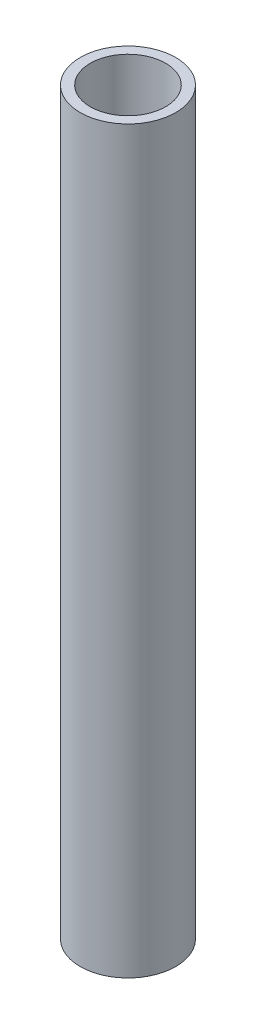
ISO-10303-21;
HEADER;
FILE_DESCRIPTION(('STEP AP214'),'2;1');
FILE_NAME('part.step','',(''),(''),'','','');
FILE_SCHEMA(('AUTOMOTIVE_DESIGN { 1 0 10303 214 1 1 1 1 }'));
ENDSEC;
DATA;
#1=APPLICATION_CONTEXT('core data for automotive mechanical design processes');
#2=APPLICATION_PROTOCOL_DEFINITION('international standard','automotive_design',2000,#1);
#3=PRODUCT_CONTEXT('',#1,'mechanical');
#4=PRODUCT('Part','Part','',(#3));
#5=PRODUCT_RELATED_PRODUCT_CATEGORY('part','',(#4));
#6=PRODUCT_DEFINITION_FORMATION('','',#4);
#7=PRODUCT_DEFINITION_CONTEXT('part definition',#1,'design');
#8=PRODUCT_DEFINITION('design','',#6,#7);
#9=PRODUCT_DEFINITION_SHAPE('','',#8);
#10=(LENGTH_UNIT() NAMED_UNIT(*) SI_UNIT(.MILLI.,.METRE.));
#11=(NAMED_UNIT(*) PLANE_ANGLE_UNIT() SI_UNIT($,.RADIAN.));
#12=(NAMED_UNIT(*) SI_UNIT($,.STERADIAN.) SOLID_ANGLE_UNIT());
#13=UNCERTAINTY_MEASURE_WITH_UNIT(LENGTH_MEASURE(1.E-05),#10,'distance_accuracy_value','');
#14=(GEOMETRIC_REPRESENTATION_CONTEXT(3) GLOBAL_UNCERTAINTY_ASSIGNED_CONTEXT((#13)) GLOBAL_UNIT_ASSIGNED_CONTEXT((#10,
#11,#12)) REPRESENTATION_CONTEXT('',''));
#15=CARTESIAN_POINT('',(0.,0.,0.));
#16=DIRECTION('',(0.,0.,1.));
#17=DIRECTION('',(1.,0.,0.));
#18=AXIS2_PLACEMENT_3D('',#15,#16,#17);
#19=CARTESIAN_POINT('',(0.,186.817,0.));
#20=DIRECTION('',(0.,1.,0.));
#21=DIRECTION('',(0.,0.,1.));
#22=AXIS2_PLACEMENT_3D('',#19,#20,#21);
#23=PLANE('',#22);
#24=CARTESIAN_POINT('',(0.,186.817,0.));
#25=DIRECTION('',(0.,1.,0.));
#26=DIRECTION('',(0.,0.,1.));
#27=AXIS2_PLACEMENT_3D('',#24,#25,#26);
#28=CIRCLE('',#27,24.13);
#29=CARTESIAN_POINT('',(0.,186.817,24.13));
#30=VERTEX_POINT('',#29);
#31=EDGE_CURVE('E10',#30,#30,#28,.T.);
#32=ORIENTED_EDGE('',*,*,#31,.T.);
#33=EDGE_LOOP('',(#32));
#34=FACE_BOUND('',#33,.T.);
#35=CARTESIAN_POINT('',(0.,186.817,0.));
#36=DIRECTION('',(0.,1.,0.));
#37=DIRECTION('',(0.,0.,1.));
#38=AXIS2_PLACEMENT_3D('',#35,#36,#37);
#39=CIRCLE('',#38,19.05);
#40=CARTESIAN_POINT('',(0.,186.817,19.05));
#41=VERTEX_POINT('',#40);
#42=EDGE_CURVE('E46',#41,#41,#39,.T.);
#43=ORIENTED_EDGE('',*,*,#42,.F.);
#44=EDGE_LOOP('',(#43));
#45=FACE_BOUND('',#44,.T.);
#46=ADVANCED_FACE('F35',(#34,#45),#23,.T.);
#47=CARTESIAN_POINT('',(0.,-186.817,0.));
#48=DIRECTION('',(0.,1.,0.));
#49=DIRECTION('',(0.,0.,1.));
#50=AXIS2_PLACEMENT_3D('',#47,#48,#49);
#51=PLANE('',#50);
#52=CARTESIAN_POINT('',(0.,-186.817,0.));
#53=DIRECTION('',(0.,1.,0.));
#54=DIRECTION('',(0.,0.,1.));
#55=AXIS2_PLACEMENT_3D('',#52,#53,#54);
#56=CIRCLE('',#55,24.13);
#57=CARTESIAN_POINT('',(0.,-186.817,24.13));
#58=VERTEX_POINT('',#57);
#59=EDGE_CURVE('E39',#58,#58,#56,.T.);
#60=ORIENTED_EDGE('',*,*,#59,.F.);
#61=EDGE_LOOP('',(#60));
#62=FACE_BOUND('',#61,.T.);
#63=CARTESIAN_POINT('',(0.,-186.817,0.));
#64=DIRECTION('',(0.,1.,0.));
#65=DIRECTION('',(0.,0.,1.));
#66=AXIS2_PLACEMENT_3D('',#63,#64,#65);
#67=CIRCLE('',#66,19.05);
#68=CARTESIAN_POINT('',(0.,-186.817,19.05));
#69=VERTEX_POINT('',#68);
#70=EDGE_CURVE('E48',#69,#69,#67,.T.);
#71=ORIENTED_EDGE('',*,*,#70,.T.);
#72=EDGE_LOOP('',(#71));
#73=FACE_BOUND('',#72,.T.);
#74=ADVANCED_FACE('F58',(#62,#73),#51,.F.);
#75=CARTESIAN_POINT('',(0.,186.817,0.));
#76=DIRECTION('',(0.,-1.,0.));
#77=DIRECTION('',(0.,0.,-1.));
#78=AXIS2_PLACEMENT_3D('',#75,#76,#77);
#79=CYLINDRICAL_SURFACE('',#78,24.13);
#80=ORIENTED_EDGE('',*,*,#31,.F.);
#81=EDGE_LOOP('',(#80));
#82=FACE_BOUND('',#81,.T.);
#83=ORIENTED_EDGE('',*,*,#59,.T.);
#84=EDGE_LOOP('',(#83));
#85=FACE_BOUND('',#84,.T.);
#86=ADVANCED_FACE('F37',(#82,#85),#79,.T.);
#87=CARTESIAN_POINT('',(0.,186.817,0.));
#88=DIRECTION('',(0.,-1.,0.));
#89=DIRECTION('',(0.,0.,-1.));
#90=AXIS2_PLACEMENT_3D('',#87,#88,#89);
#91=CYLINDRICAL_SURFACE('',#90,19.05);
#92=ORIENTED_EDGE('',*,*,#42,.T.);
#93=EDGE_LOOP('',(#92));
#94=FACE_BOUND('',#93,.T.);
#95=ORIENTED_EDGE('',*,*,#70,.F.);
#96=EDGE_LOOP('',(#95));
#97=FACE_BOUND('',#96,.T.);
#98=ADVANCED_FACE('F54',(#94,#97),#91,.F.);
#99=CLOSED_SHELL('',(#46,#74,#86,#98));
#100=MANIFOLD_SOLID_BREP('B2',#99);
#101=ADVANCED_BREP_SHAPE_REPRESENTATION('',(#18,#100),#14);
#102=SHAPE_DEFINITION_REPRESENTATION(#9,#101);
ENDSEC;
END-ISO-10303-21;
